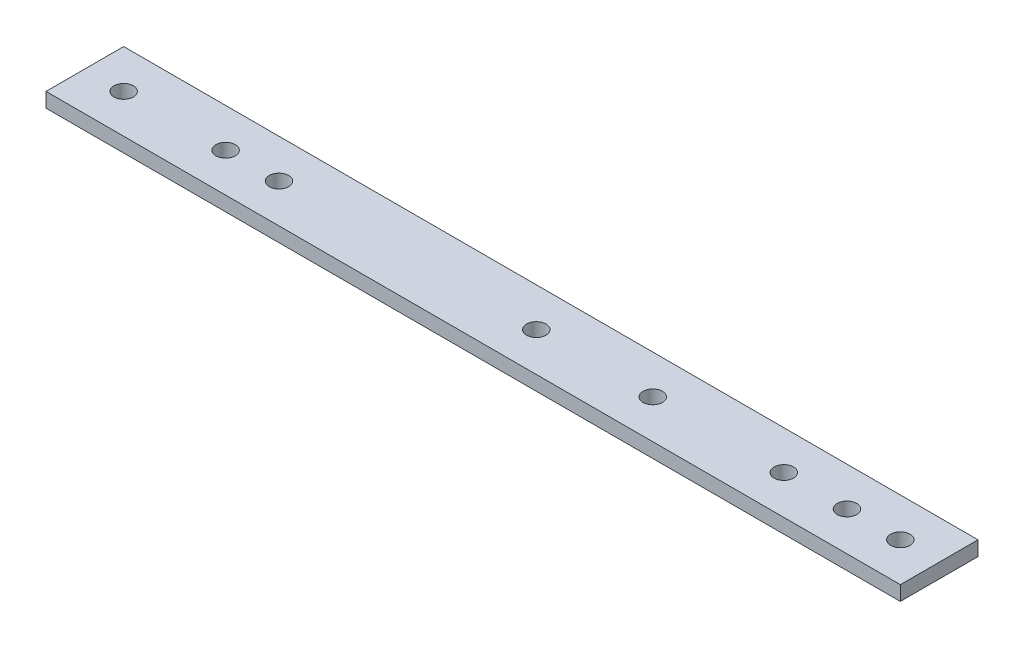
ISO-10303-21;
HEADER;
FILE_DESCRIPTION(('STEP AP214'),'2;1');
FILE_NAME('part.step','',(''),(''),'','','');
FILE_SCHEMA(('AUTOMOTIVE_DESIGN { 1 0 10303 214 1 1 1 1 }'));
ENDSEC;
DATA;
#1=APPLICATION_CONTEXT('core data for automotive mechanical design processes');
#2=APPLICATION_PROTOCOL_DEFINITION('international standard','automotive_design',2000,#1);
#3=PRODUCT_CONTEXT('',#1,'mechanical');
#4=PRODUCT('Part','Part','',(#3));
#5=PRODUCT_RELATED_PRODUCT_CATEGORY('part','',(#4));
#6=PRODUCT_DEFINITION_FORMATION('','',#4);
#7=PRODUCT_DEFINITION_CONTEXT('part definition',#1,'design');
#8=PRODUCT_DEFINITION('design','',#6,#7);
#9=PRODUCT_DEFINITION_SHAPE('','',#8);
#10=(LENGTH_UNIT() NAMED_UNIT(*) SI_UNIT(.MILLI.,.METRE.));
#11=(NAMED_UNIT(*) PLANE_ANGLE_UNIT() SI_UNIT($,.RADIAN.));
#12=(NAMED_UNIT(*) SI_UNIT($,.STERADIAN.) SOLID_ANGLE_UNIT());
#13=UNCERTAINTY_MEASURE_WITH_UNIT(LENGTH_MEASURE(1.E-05),#10,'distance_accuracy_value','');
#14=(GEOMETRIC_REPRESENTATION_CONTEXT(3) GLOBAL_UNCERTAINTY_ASSIGNED_CONTEXT((#13)) GLOBAL_UNIT_ASSIGNED_CONTEXT((#10,
#11,#12)) REPRESENTATION_CONTEXT('',''));
#15=CARTESIAN_POINT('',(0.,0.,0.));
#16=DIRECTION('',(0.,0.,1.));
#17=DIRECTION('',(1.,0.,0.));
#18=AXIS2_PLACEMENT_3D('',#15,#16,#17);
#19=CARTESIAN_POINT('',(-139.7,4.7625,12.7));
#20=DIRECTION('',(1.,0.,0.));
#21=DIRECTION('',(0.,0.,-1.));
#22=AXIS2_PLACEMENT_3D('',#19,#20,#21);
#23=PLANE('',#22);
#24=DIRECTION('',(0.,0.,1.));
#25=VECTOR('',#24,1.);
#26=CARTESIAN_POINT('',(-139.7,0.,12.7));
#27=LINE('',#26,#25);
#28=CARTESIAN_POINT('',(-139.7,0.,-12.7));
#29=VERTEX_POINT('',#28);
#30=CARTESIAN_POINT('',(-139.7,0.,12.7));
#31=VERTEX_POINT('',#30);
#32=EDGE_CURVE('E99',#29,#31,#27,.T.);
#33=ORIENTED_EDGE('',*,*,#32,.T.);
#34=DIRECTION('',(0.,-1.,0.));
#35=VECTOR('',#34,1.);
#36=CARTESIAN_POINT('',(-139.7,4.7625,12.7));
#37=LINE('',#36,#35);
#38=CARTESIAN_POINT('',(-139.7,4.7625,12.7));
#39=VERTEX_POINT('',#38);
#40=EDGE_CURVE('E11',#39,#31,#37,.T.);
#41=ORIENTED_EDGE('',*,*,#40,.F.);
#42=DIRECTION('',(0.,0.,1.));
#43=VECTOR('',#42,1.);
#44=CARTESIAN_POINT('',(-139.7,4.7625,12.7));
#45=LINE('',#44,#43);
#46=CARTESIAN_POINT('',(-139.7,4.7625,-12.7));
#47=VERTEX_POINT('',#46);
#48=EDGE_CURVE('E87',#47,#39,#45,.T.);
#49=ORIENTED_EDGE('',*,*,#48,.F.);
#50=DIRECTION('',(0.,-1.,0.));
#51=VECTOR('',#50,1.);
#52=CARTESIAN_POINT('',(-139.7,4.7625,-12.7));
#53=LINE('',#52,#51);
#54=EDGE_CURVE('E95',#47,#29,#53,.T.);
#55=ORIENTED_EDGE('',*,*,#54,.T.);
#56=EDGE_LOOP('',(#33,#41,#49,#55));
#57=FACE_BOUND('',#56,.T.);
#58=ADVANCED_FACE('F36',(#57),#23,.F.);
#59=CARTESIAN_POINT('',(139.7,4.7625,12.7));
#60=DIRECTION('',(0.,0.,-1.));
#61=DIRECTION('',(-1.,0.,0.));
#62=AXIS2_PLACEMENT_3D('',#59,#60,#61);
#63=PLANE('',#62);
#64=DIRECTION('',(1.,0.,0.));
#65=VECTOR('',#64,1.);
#66=CARTESIAN_POINT('',(139.7,0.,12.7));
#67=LINE('',#66,#65);
#68=CARTESIAN_POINT('',(139.7,0.,12.7));
#69=VERTEX_POINT('',#68);
#70=EDGE_CURVE('E91',#31,#69,#67,.T.);
#71=ORIENTED_EDGE('',*,*,#70,.T.);
#72=DIRECTION('',(0.,-1.,0.));
#73=VECTOR('',#72,1.);
#74=CARTESIAN_POINT('',(139.7,4.7625,12.7));
#75=LINE('',#74,#73);
#76=CARTESIAN_POINT('',(139.7,4.7625,12.7));
#77=VERTEX_POINT('',#76);
#78=EDGE_CURVE('E44',#77,#69,#75,.T.);
#79=ORIENTED_EDGE('',*,*,#78,.F.);
#80=DIRECTION('',(1.,0.,0.));
#81=VECTOR('',#80,1.);
#82=CARTESIAN_POINT('',(139.7,4.7625,12.7));
#83=LINE('',#82,#81);
#84=EDGE_CURVE('E82',#39,#77,#83,.T.);
#85=ORIENTED_EDGE('',*,*,#84,.F.);
#86=ORIENTED_EDGE('',*,*,#40,.T.);
#87=EDGE_LOOP('',(#71,#79,#85,#86));
#88=FACE_BOUND('',#87,.T.);
#89=ADVANCED_FACE('F90',(#88),#63,.F.);
#90=CARTESIAN_POINT('',(139.7,4.7625,12.7));
#91=DIRECTION('',(-1.,0.,0.));
#92=DIRECTION('',(0.,0.,1.));
#93=AXIS2_PLACEMENT_3D('',#90,#91,#92);
#94=PLANE('',#93);
#95=DIRECTION('',(0.,0.,-1.));
#96=VECTOR('',#95,1.);
#97=CARTESIAN_POINT('',(139.7,0.,12.7));
#98=LINE('',#97,#96);
#99=CARTESIAN_POINT('',(139.7,0.,-12.7));
#100=VERTEX_POINT('',#99);
#101=EDGE_CURVE('E69',#69,#100,#98,.T.);
#102=ORIENTED_EDGE('',*,*,#101,.T.);
#103=DIRECTION('',(0.,-1.,0.));
#104=VECTOR('',#103,1.);
#105=CARTESIAN_POINT('',(139.7,4.7625,-12.7));
#106=LINE('',#105,#104);
#107=CARTESIAN_POINT('',(139.7,4.7625,-12.7));
#108=VERTEX_POINT('',#107);
#109=EDGE_CURVE('E92',#108,#100,#106,.T.);
#110=ORIENTED_EDGE('',*,*,#109,.F.);
#111=DIRECTION('',(0.,0.,-1.));
#112=VECTOR('',#111,1.);
#113=CARTESIAN_POINT('',(139.7,4.7625,12.7));
#114=LINE('',#113,#112);
#115=EDGE_CURVE('E85',#77,#108,#114,.T.);
#116=ORIENTED_EDGE('',*,*,#115,.F.);
#117=ORIENTED_EDGE('',*,*,#78,.T.);
#118=EDGE_LOOP('',(#102,#110,#116,#117));
#119=FACE_BOUND('',#118,.T.);
#120=ADVANCED_FACE('F93',(#119),#94,.F.);
#121=CARTESIAN_POINT('',(139.7,4.7625,-12.7));
#122=DIRECTION('',(0.,0.,1.));
#123=DIRECTION('',(1.,0.,0.));
#124=AXIS2_PLACEMENT_3D('',#121,#122,#123);
#125=PLANE('',#124);
#126=DIRECTION('',(-1.,0.,0.));
#127=VECTOR('',#126,1.);
#128=CARTESIAN_POINT('',(139.7,0.,-12.7));
#129=LINE('',#128,#127);
#130=EDGE_CURVE('E75',#100,#29,#129,.T.);
#131=ORIENTED_EDGE('',*,*,#130,.T.);
#132=ORIENTED_EDGE('',*,*,#54,.F.);
#133=DIRECTION('',(-1.,0.,0.));
#134=VECTOR('',#133,1.);
#135=CARTESIAN_POINT('',(139.7,4.7625,-12.7));
#136=LINE('',#135,#134);
#137=EDGE_CURVE('E52',#108,#47,#136,.T.);
#138=ORIENTED_EDGE('',*,*,#137,.F.);
#139=ORIENTED_EDGE('',*,*,#109,.T.);
#140=EDGE_LOOP('',(#131,#132,#138,#139));
#141=FACE_BOUND('',#140,.T.);
#142=ADVANCED_FACE('F107',(#141),#125,.F.);
#143=CARTESIAN_POINT('',(0.,4.7625,0.));
#144=DIRECTION('',(0.,1.,0.));
#145=DIRECTION('',(0.,0.,1.));
#146=AXIS2_PLACEMENT_3D('',#143,#144,#145);
#147=PLANE('',#146);
#148=CARTESIAN_POINT('',(127.,4.7625,0.));
#149=DIRECTION('',(0.,1.,0.));
#150=DIRECTION('',(0.,0.,1.));
#151=AXIS2_PLACEMENT_3D('',#148,#149,#150);
#152=CIRCLE('',#151,3.175);
#153=CARTESIAN_POINT('',(127.,4.7625,3.175));
#154=VERTEX_POINT('',#153);
#155=EDGE_CURVE('E153',#154,#154,#152,.T.);
#156=ORIENTED_EDGE('',*,*,#155,.F.);
#157=EDGE_LOOP('',(#156));
#158=FACE_BOUND('',#157,.T.);
#159=CARTESIAN_POINT('',(109.5375,4.7625,0.));
#160=DIRECTION('',(0.,1.,0.));
#161=DIRECTION('',(0.,0.,1.));
#162=AXIS2_PLACEMENT_3D('',#159,#160,#161);
#163=CIRCLE('',#162,3.175);
#164=CARTESIAN_POINT('',(109.5375,4.7625,3.175));
#165=VERTEX_POINT('',#164);
#166=EDGE_CURVE('E147',#165,#165,#163,.T.);
#167=ORIENTED_EDGE('',*,*,#166,.F.);
#168=EDGE_LOOP('',(#167));
#169=FACE_BOUND('',#168,.T.);
#170=CARTESIAN_POINT('',(88.8999999999999,4.7625,0.));
#171=DIRECTION('',(0.,1.,0.));
#172=DIRECTION('',(0.,0.,1.));
#173=AXIS2_PLACEMENT_3D('',#170,#171,#172);
#174=CIRCLE('',#173,3.175);
#175=CARTESIAN_POINT('',(88.8999999999999,4.7625,3.175));
#176=VERTEX_POINT('',#175);
#177=EDGE_CURVE('E141',#176,#176,#174,.T.);
#178=ORIENTED_EDGE('',*,*,#177,.F.);
#179=EDGE_LOOP('',(#178));
#180=FACE_BOUND('',#179,.T.);
#181=CARTESIAN_POINT('',(46.0374999999999,4.7625,0.));
#182=DIRECTION('',(0.,1.,0.));
#183=DIRECTION('',(0.,0.,1.));
#184=AXIS2_PLACEMENT_3D('',#181,#182,#183);
#185=CIRCLE('',#184,3.175);
#186=CARTESIAN_POINT('',(46.0374999999999,4.7625,3.175));
#187=VERTEX_POINT('',#186);
#188=EDGE_CURVE('E135',#187,#187,#185,.T.);
#189=ORIENTED_EDGE('',*,*,#188,.F.);
#190=EDGE_LOOP('',(#189));
#191=FACE_BOUND('',#190,.T.);
#192=CARTESIAN_POINT('',(7.93749999999993,4.7625,0.));
#193=DIRECTION('',(0.,1.,0.));
#194=DIRECTION('',(0.,0.,1.));
#195=AXIS2_PLACEMENT_3D('',#192,#193,#194);
#196=CIRCLE('',#195,3.175);
#197=CARTESIAN_POINT('',(7.93749999999993,4.7625,3.175));
#198=VERTEX_POINT('',#197);
#199=EDGE_CURVE('E124',#198,#198,#196,.T.);
#200=ORIENTED_EDGE('',*,*,#199,.F.);
#201=EDGE_LOOP('',(#200));
#202=FACE_BOUND('',#201,.T.);
#203=CARTESIAN_POINT('',(-93.6625000000001,4.7625,0.));
#204=DIRECTION('',(0.,1.,0.));
#205=DIRECTION('',(0.,0.,1.));
#206=AXIS2_PLACEMENT_3D('',#203,#204,#205);
#207=CIRCLE('',#206,3.175);
#208=CARTESIAN_POINT('',(-93.6625000000001,4.7625,3.175));
#209=VERTEX_POINT('',#208);
#210=EDGE_CURVE('E129',#209,#209,#207,.T.);
#211=ORIENTED_EDGE('',*,*,#210,.F.);
#212=EDGE_LOOP('',(#211));
#213=FACE_BOUND('',#212,.T.);
#214=CARTESIAN_POINT('',(-127.,4.7625,0.));
#215=DIRECTION('',(0.,1.,0.));
#216=DIRECTION('',(0.,0.,1.));
#217=AXIS2_PLACEMENT_3D('',#214,#215,#216);
#218=CIRCLE('',#217,3.175);
#219=CARTESIAN_POINT('',(-127.,4.7625,3.175));
#220=VERTEX_POINT('',#219);
#221=EDGE_CURVE('E117',#220,#220,#218,.T.);
#222=ORIENTED_EDGE('',*,*,#221,.F.);
#223=EDGE_LOOP('',(#222));
#224=FACE_BOUND('',#223,.T.);
#225=CARTESIAN_POINT('',(-76.2,4.7625,0.));
#226=DIRECTION('',(0.,1.,0.));
#227=DIRECTION('',(0.,0.,1.));
#228=AXIS2_PLACEMENT_3D('',#225,#226,#227);
#229=CIRCLE('',#228,3.175);
#230=CARTESIAN_POINT('',(-76.2,4.7625,3.175));
#231=VERTEX_POINT('',#230);
#232=EDGE_CURVE('E116',#231,#231,#229,.T.);
#233=ORIENTED_EDGE('',*,*,#232,.F.);
#234=EDGE_LOOP('',(#233));
#235=FACE_BOUND('',#234,.T.);
#236=ORIENTED_EDGE('',*,*,#48,.T.);
#237=ORIENTED_EDGE('',*,*,#84,.T.);
#238=ORIENTED_EDGE('',*,*,#115,.T.);
#239=ORIENTED_EDGE('',*,*,#137,.T.);
#240=EDGE_LOOP('',(#236,#237,#238,#239));
#241=FACE_BOUND('',#240,.T.);
#242=ADVANCED_FACE('F83',(#158,#169,#180,#191,#202,#213,#224,#235,#241),#147,.T.);
#243=CARTESIAN_POINT('',(0.,0.,0.));
#244=DIRECTION('',(0.,1.,0.));
#245=DIRECTION('',(0.,0.,1.));
#246=AXIS2_PLACEMENT_3D('',#243,#244,#245);
#247=PLANE('',#246);
#248=CARTESIAN_POINT('',(127.,0.,0.));
#249=DIRECTION('',(0.,1.,0.));
#250=DIRECTION('',(0.,0.,1.));
#251=AXIS2_PLACEMENT_3D('',#248,#249,#250);
#252=CIRCLE('',#251,3.175);
#253=CARTESIAN_POINT('',(127.,0.,3.175));
#254=VERTEX_POINT('',#253);
#255=EDGE_CURVE('E102',#254,#254,#252,.F.);
#256=ORIENTED_EDGE('',*,*,#255,.F.);
#257=EDGE_LOOP('',(#256));
#258=FACE_BOUND('',#257,.T.);
#259=CARTESIAN_POINT('',(109.5375,0.,0.));
#260=DIRECTION('',(0.,1.,0.));
#261=DIRECTION('',(0.,0.,1.));
#262=AXIS2_PLACEMENT_3D('',#259,#260,#261);
#263=CIRCLE('',#262,3.175);
#264=CARTESIAN_POINT('',(109.5375,0.,3.175));
#265=VERTEX_POINT('',#264);
#266=EDGE_CURVE('E150',#265,#265,#263,.F.);
#267=ORIENTED_EDGE('',*,*,#266,.F.);
#268=EDGE_LOOP('',(#267));
#269=FACE_BOUND('',#268,.T.);
#270=CARTESIAN_POINT('',(88.8999999999999,0.,0.));
#271=DIRECTION('',(0.,1.,0.));
#272=DIRECTION('',(0.,0.,1.));
#273=AXIS2_PLACEMENT_3D('',#270,#271,#272);
#274=CIRCLE('',#273,3.175);
#275=CARTESIAN_POINT('',(88.8999999999999,0.,3.175));
#276=VERTEX_POINT('',#275);
#277=EDGE_CURVE('E144',#276,#276,#274,.F.);
#278=ORIENTED_EDGE('',*,*,#277,.F.);
#279=EDGE_LOOP('',(#278));
#280=FACE_BOUND('',#279,.T.);
#281=CARTESIAN_POINT('',(46.0374999999999,0.,0.));
#282=DIRECTION('',(0.,1.,0.));
#283=DIRECTION('',(0.,0.,1.));
#284=AXIS2_PLACEMENT_3D('',#281,#282,#283);
#285=CIRCLE('',#284,3.175);
#286=CARTESIAN_POINT('',(46.0374999999999,0.,3.175));
#287=VERTEX_POINT('',#286);
#288=EDGE_CURVE('E138',#287,#287,#285,.F.);
#289=ORIENTED_EDGE('',*,*,#288,.F.);
#290=EDGE_LOOP('',(#289));
#291=FACE_BOUND('',#290,.T.);
#292=CARTESIAN_POINT('',(7.93749999999993,0.,0.));
#293=DIRECTION('',(0.,1.,0.));
#294=DIRECTION('',(0.,0.,1.));
#295=AXIS2_PLACEMENT_3D('',#292,#293,#294);
#296=CIRCLE('',#295,3.175);
#297=CARTESIAN_POINT('',(7.93749999999993,0.,3.175));
#298=VERTEX_POINT('',#297);
#299=EDGE_CURVE('E132',#298,#298,#296,.F.);
#300=ORIENTED_EDGE('',*,*,#299,.F.);
#301=EDGE_LOOP('',(#300));
#302=FACE_BOUND('',#301,.T.);
#303=CARTESIAN_POINT('',(-93.6625000000001,0.,0.));
#304=DIRECTION('',(0.,1.,0.));
#305=DIRECTION('',(0.,0.,1.));
#306=AXIS2_PLACEMENT_3D('',#303,#304,#305);
#307=CIRCLE('',#306,3.175);
#308=CARTESIAN_POINT('',(-93.6625000000001,0.,3.175));
#309=VERTEX_POINT('',#308);
#310=EDGE_CURVE('E120',#309,#309,#307,.F.);
#311=ORIENTED_EDGE('',*,*,#310,.F.);
#312=EDGE_LOOP('',(#311));
#313=FACE_BOUND('',#312,.T.);
#314=CARTESIAN_POINT('',(-127.,0.,0.));
#315=DIRECTION('',(0.,1.,0.));
#316=DIRECTION('',(0.,0.,1.));
#317=AXIS2_PLACEMENT_3D('',#314,#315,#316);
#318=CIRCLE('',#317,3.175);
#319=CARTESIAN_POINT('',(-127.,0.,3.175));
#320=VERTEX_POINT('',#319);
#321=EDGE_CURVE('E113',#320,#320,#318,.F.);
#322=ORIENTED_EDGE('',*,*,#321,.F.);
#323=EDGE_LOOP('',(#322));
#324=FACE_BOUND('',#323,.T.);
#325=CARTESIAN_POINT('',(-76.2,0.,0.));
#326=DIRECTION('',(0.,1.,0.));
#327=DIRECTION('',(0.,0.,1.));
#328=AXIS2_PLACEMENT_3D('',#325,#326,#327);
#329=CIRCLE('',#328,3.175);
#330=CARTESIAN_POINT('',(-76.2,0.,3.175));
#331=VERTEX_POINT('',#330);
#332=EDGE_CURVE('E121',#331,#331,#329,.F.);
#333=ORIENTED_EDGE('',*,*,#332,.F.);
#334=EDGE_LOOP('',(#333));
#335=FACE_BOUND('',#334,.T.);
#336=ORIENTED_EDGE('',*,*,#32,.F.);
#337=ORIENTED_EDGE('',*,*,#130,.F.);
#338=ORIENTED_EDGE('',*,*,#101,.F.);
#339=ORIENTED_EDGE('',*,*,#70,.F.);
#340=EDGE_LOOP('',(#336,#337,#338,#339));
#341=FACE_BOUND('',#340,.T.);
#342=ADVANCED_FACE('F110',(#258,#269,#280,#291,#302,#313,#324,#335,#341),#247,.F.);
#343=CARTESIAN_POINT('',(-76.2,-8.98025612106916,0.));
#344=DIRECTION('',(0.,1.,0.));
#345=DIRECTION('',(0.,0.,1.));
#346=AXIS2_PLACEMENT_3D('',#343,#344,#345);
#347=CYLINDRICAL_SURFACE('',#346,3.175);
#348=ORIENTED_EDGE('',*,*,#332,.T.);
#349=EDGE_LOOP('',(#348));
#350=FACE_BOUND('',#349,.T.);
#351=ORIENTED_EDGE('',*,*,#232,.T.);
#352=EDGE_LOOP('',(#351));
#353=FACE_BOUND('',#352,.T.);
#354=ADVANCED_FACE('F180',(#350,#353),#347,.F.);
#355=CARTESIAN_POINT('',(-127.,-8.98025612106916,0.));
#356=DIRECTION('',(0.,1.,0.));
#357=DIRECTION('',(0.,0.,1.));
#358=AXIS2_PLACEMENT_3D('',#355,#356,#357);
#359=CYLINDRICAL_SURFACE('',#358,3.175);
#360=ORIENTED_EDGE('',*,*,#321,.T.);
#361=EDGE_LOOP('',(#360));
#362=FACE_BOUND('',#361,.T.);
#363=ORIENTED_EDGE('',*,*,#221,.T.);
#364=EDGE_LOOP('',(#363));
#365=FACE_BOUND('',#364,.T.);
#366=ADVANCED_FACE('F182',(#362,#365),#359,.F.);
#367=CARTESIAN_POINT('',(-93.6625000000001,-8.98025612106916,0.));
#368=DIRECTION('',(0.,1.,0.));
#369=DIRECTION('',(0.,0.,1.));
#370=AXIS2_PLACEMENT_3D('',#367,#368,#369);
#371=CYLINDRICAL_SURFACE('',#370,3.175);
#372=ORIENTED_EDGE('',*,*,#310,.T.);
#373=EDGE_LOOP('',(#372));
#374=FACE_BOUND('',#373,.T.);
#375=ORIENTED_EDGE('',*,*,#210,.T.);
#376=EDGE_LOOP('',(#375));
#377=FACE_BOUND('',#376,.T.);
#378=ADVANCED_FACE('F189',(#374,#377),#371,.F.);
#379=CARTESIAN_POINT('',(7.93749999999993,-8.98025612106916,0.));
#380=DIRECTION('',(0.,1.,0.));
#381=DIRECTION('',(0.,0.,1.));
#382=AXIS2_PLACEMENT_3D('',#379,#380,#381);
#383=CYLINDRICAL_SURFACE('',#382,3.175);
#384=ORIENTED_EDGE('',*,*,#299,.T.);
#385=EDGE_LOOP('',(#384));
#386=FACE_BOUND('',#385,.T.);
#387=ORIENTED_EDGE('',*,*,#199,.T.);
#388=EDGE_LOOP('',(#387));
#389=FACE_BOUND('',#388,.T.);
#390=ADVANCED_FACE('F236',(#386,#389),#383,.F.);
#391=CARTESIAN_POINT('',(46.0374999999999,-8.98025612106916,0.));
#392=DIRECTION('',(0.,1.,0.));
#393=DIRECTION('',(0.,0.,1.));
#394=AXIS2_PLACEMENT_3D('',#391,#392,#393);
#395=CYLINDRICAL_SURFACE('',#394,3.175);
#396=ORIENTED_EDGE('',*,*,#288,.T.);
#397=EDGE_LOOP('',(#396));
#398=FACE_BOUND('',#397,.T.);
#399=ORIENTED_EDGE('',*,*,#188,.T.);
#400=EDGE_LOOP('',(#399));
#401=FACE_BOUND('',#400,.T.);
#402=ADVANCED_FACE('F245',(#398,#401),#395,.F.);
#403=CARTESIAN_POINT('',(88.8999999999999,-8.98025612106916,0.));
#404=DIRECTION('',(0.,1.,0.));
#405=DIRECTION('',(0.,0.,1.));
#406=AXIS2_PLACEMENT_3D('',#403,#404,#405);
#407=CYLINDRICAL_SURFACE('',#406,3.175);
#408=ORIENTED_EDGE('',*,*,#277,.T.);
#409=EDGE_LOOP('',(#408));
#410=FACE_BOUND('',#409,.T.);
#411=ORIENTED_EDGE('',*,*,#177,.T.);
#412=EDGE_LOOP('',(#411));
#413=FACE_BOUND('',#412,.T.);
#414=ADVANCED_FACE('F255',(#410,#413),#407,.F.);
#415=CARTESIAN_POINT('',(109.5375,-8.98025612106916,0.));
#416=DIRECTION('',(0.,1.,0.));
#417=DIRECTION('',(0.,0.,1.));
#418=AXIS2_PLACEMENT_3D('',#415,#416,#417);
#419=CYLINDRICAL_SURFACE('',#418,3.175);
#420=ORIENTED_EDGE('',*,*,#266,.T.);
#421=EDGE_LOOP('',(#420));
#422=FACE_BOUND('',#421,.T.);
#423=ORIENTED_EDGE('',*,*,#166,.T.);
#424=EDGE_LOOP('',(#423));
#425=FACE_BOUND('',#424,.T.);
#426=ADVANCED_FACE('F265',(#422,#425),#419,.F.);
#427=CARTESIAN_POINT('',(127.,-8.98025612106916,0.));
#428=DIRECTION('',(0.,1.,0.));
#429=DIRECTION('',(0.,0.,1.));
#430=AXIS2_PLACEMENT_3D('',#427,#428,#429);
#431=CYLINDRICAL_SURFACE('',#430,3.175);
#432=ORIENTED_EDGE('',*,*,#255,.T.);
#433=EDGE_LOOP('',(#432));
#434=FACE_BOUND('',#433,.T.);
#435=ORIENTED_EDGE('',*,*,#155,.T.);
#436=EDGE_LOOP('',(#435));
#437=FACE_BOUND('',#436,.T.);
#438=ADVANCED_FACE('F161',(#434,#437),#431,.F.);
#439=CLOSED_SHELL('',(#58,#89,#120,#142,#242,#342,#354,#366,#378,#390,#402,#414,#426,#438));
#440=MANIFOLD_SOLID_BREP('B2',#439);
#441=ADVANCED_BREP_SHAPE_REPRESENTATION('',(#18,#440),#14);
#442=SHAPE_DEFINITION_REPRESENTATION(#9,#441);
ENDSEC;
END-ISO-10303-21;
